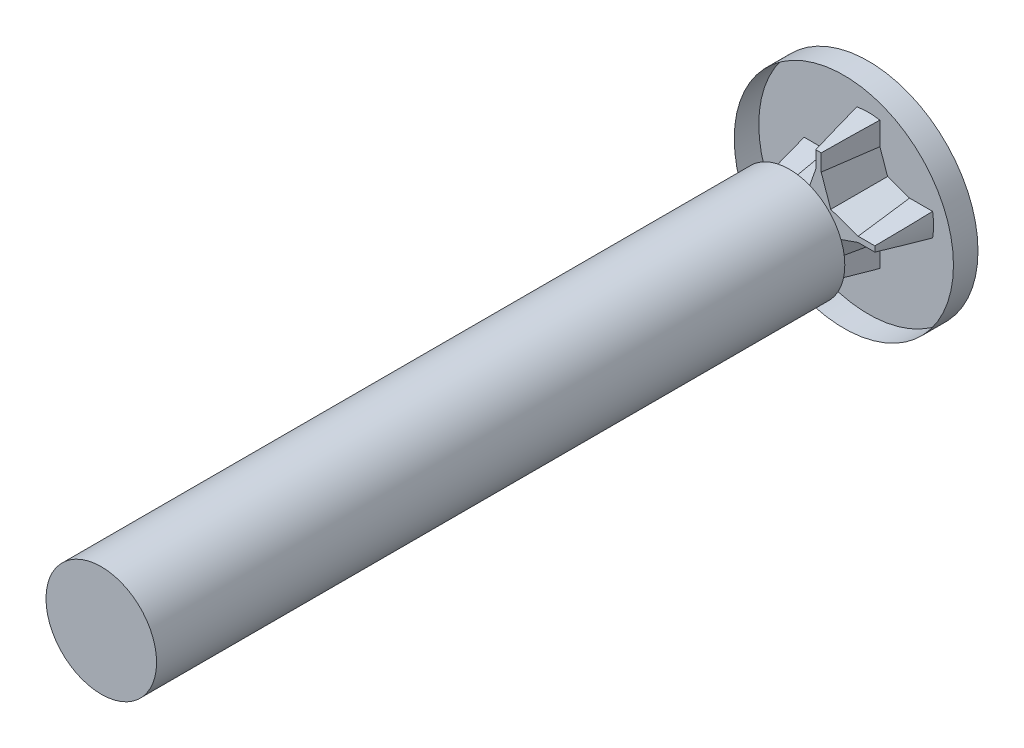
ISO-10303-21;
HEADER;
FILE_DESCRIPTION(('STEP AP214'),'2;1');
FILE_NAME('part.step','',(''),(''),'','','');
FILE_SCHEMA(('AUTOMOTIVE_DESIGN { 1 0 10303 214 1 1 1 1 }'));
ENDSEC;
DATA;
#1=APPLICATION_CONTEXT('core data for automotive mechanical design processes');
#2=APPLICATION_PROTOCOL_DEFINITION('international standard','automotive_design',2000,#1);
#3=PRODUCT_CONTEXT('',#1,'mechanical');
#4=PRODUCT('Part','Part','',(#3));
#5=PRODUCT_RELATED_PRODUCT_CATEGORY('part','',(#4));
#6=PRODUCT_DEFINITION_FORMATION('','',#4);
#7=PRODUCT_DEFINITION_CONTEXT('part definition',#1,'design');
#8=PRODUCT_DEFINITION('design','',#6,#7);
#9=PRODUCT_DEFINITION_SHAPE('','',#8);
#10=(LENGTH_UNIT() NAMED_UNIT(*) SI_UNIT(.MILLI.,.METRE.));
#11=(NAMED_UNIT(*) PLANE_ANGLE_UNIT() SI_UNIT($,.RADIAN.));
#12=(NAMED_UNIT(*) SI_UNIT($,.STERADIAN.) SOLID_ANGLE_UNIT());
#13=UNCERTAINTY_MEASURE_WITH_UNIT(LENGTH_MEASURE(1.E-05),#10,'distance_accuracy_value','');
#14=(GEOMETRIC_REPRESENTATION_CONTEXT(3) GLOBAL_UNCERTAINTY_ASSIGNED_CONTEXT((#13)) GLOBAL_UNIT_ASSIGNED_CONTEXT((#10,
#11,#12)) REPRESENTATION_CONTEXT('',''));
#15=CARTESIAN_POINT('',(0.,0.,0.));
#16=DIRECTION('',(0.,0.,1.));
#17=DIRECTION('',(1.,0.,0.));
#18=AXIS2_PLACEMENT_3D('',#15,#16,#17);
#19=CARTESIAN_POINT('',(-84.4266799469319,-54.699999999999,-15.25));
#20=DIRECTION('',(0.324374951621023,0.929853322386823,0.173648177666931));
#21=DIRECTION('',(0.,0.18357429952419,-0.983005837497521));
#22=AXIS2_PLACEMENT_3D('',#19,#20,#21);
#23=PLANE('',#22);
#24=DIRECTION('',(-0.944197808701955,0.329378958105137,0.));
#25=VECTOR('',#24,1.);
#26=CARTESIAN_POINT('',(-86.1310974403809,-54.1054219857371,-15.25));
#27=LINE('',#26,#25);
#28=CARTESIAN_POINT('',(-84.4266799469319,-54.699999999999,-15.25));
#29=VERTEX_POINT('',#28);
#30=CARTESIAN_POINT('',(-85.,-54.499999999999,-15.25));
#31=VERTEX_POINT('',#30);
#32=EDGE_CURVE('E39',#29,#31,#27,.T.);
#33=ORIENTED_EDGE('',*,*,#32,.F.);
#34=DIRECTION('',(-0.0294061236684748,-0.173573082893852,0.984381869390898));
#35=VECTOR('',#34,1.);
#36=CARTESIAN_POINT('',(-84.4264205308991,-54.6984687665366,-15.2586840564965));
#37=LINE('',#36,#35);
#38=CARTESIAN_POINT('',(-84.4655144297253,-54.92922507492,-13.95));
#39=VERTEX_POINT('',#38);
#40=EDGE_CURVE('E11',#29,#39,#37,.T.);
#41=ORIENTED_EDGE('',*,*,#40,.T.);
#42=DIRECTION('',(-0.944197808701955,0.329378958105137,0.));
#43=VECTOR('',#42,1.);
#44=CARTESIAN_POINT('',(-85.0691596927764,-54.7186462682584,-13.95));
#45=LINE('',#44,#43);
#46=CARTESIAN_POINT('',(-85.1799852830982,-54.6799852830971,-13.95));
#47=VERTEX_POINT('',#46);
#48=EDGE_CURVE('E27',#39,#47,#45,.T.);
#49=ORIENTED_EDGE('',*,*,#48,.T.);
#50=DIRECTION('',(-0.135870287320786,-0.135870287320797,0.981365645438402));
#51=VECTOR('',#50,1.);
#52=CARTESIAN_POINT('',(-84.9965541187195,-54.4965541187184,-15.2748889552948));
#53=LINE('',#52,#51);
#54=EDGE_CURVE('E294',#31,#47,#53,.T.);
#55=ORIENTED_EDGE('',*,*,#54,.F.);
#56=EDGE_LOOP('',(#33,#41,#49,#55));
#57=FACE_BOUND('',#56,.T.);
#58=ADVANCED_FACE('F17',(#57),#23,.F.);
#59=CARTESIAN_POINT('',(-83.8266799469319,-54.6999999999989,-15.25));
#60=DIRECTION('',(0.,0.984807753012208,0.17364817766693));
#61=DIRECTION('',(0.,0.17364817766693,-0.984807753012208));
#62=AXIS2_PLACEMENT_3D('',#59,#60,#61);
#63=PLANE('',#62);
#64=DIRECTION('',(-1.,0.,0.));
#65=VECTOR('',#64,1.);
#66=CARTESIAN_POINT('',(-86.0908399734659,-54.699999999999,-15.25));
#67=LINE('',#66,#65);
#68=CARTESIAN_POINT('',(-83.8266799469319,-54.6999999999989,-15.25));
#69=VERTEX_POINT('',#68);
#70=EDGE_CURVE('E292',#69,#29,#67,.T.);
#71=ORIENTED_EDGE('',*,*,#70,.F.);
#72=CARTESIAN_POINT('',(-83.8266799468012,-54.6999999999881,-15.2500000000479));
#73=CARTESIAN_POINT('',(-83.9288044414766,-54.8220621177477,-14.5577513307343));
#74=CARTESIAN_POINT('',(-84.0309289361519,-54.9292250749176,-13.95));
#75=(BOUNDED_CURVE() B_SPLINE_CURVE(2,(#72,#73,#74),.UNSPECIFIED.,.F.,
.F.) B_SPLINE_CURVE_WITH_KNOTS((3,3),(-111.917898219589,-110.972377017426),
.UNSPECIFIED.) CURVE() GEOMETRIC_REPRESENTATION_ITEM() RATIONAL_B_SPLINE_CURVE((1.,1.,1.)) REPRESENTATION_ITEM(''));
#76=CARTESIAN_POINT('',(-84.030928936293,-54.92922507492,-13.95));
#77=VERTEX_POINT('',#76);
#78=EDGE_CURVE('E402',#69,#77,#75,.T.);
#79=ORIENTED_EDGE('',*,*,#78,.T.);
#80=DIRECTION('',(-1.,0.,0.));
#81=VECTOR('',#80,1.);
#82=CARTESIAN_POINT('',(-84.6633399734659,-54.92922507492,-13.95));
#83=LINE('',#82,#81);
#84=EDGE_CURVE('E411',#77,#39,#83,.T.);
#85=ORIENTED_EDGE('',*,*,#84,.T.);
#86=ORIENTED_EDGE('',*,*,#40,.F.);
#87=EDGE_LOOP('',(#71,#79,#85,#86));
#88=FACE_BOUND('',#87,.T.);
#89=ADVANCED_FACE('F19',(#88),#63,.F.);
#90=CARTESIAN_POINT('',(-85.5,-54.999999999999,-15.25));
#91=DIRECTION('',(0.,0.,-1.));
#92=DIRECTION('',(-0.984305913569494,-0.176470588235328,0.));
#93=AXIS2_PLACEMENT_3D('',#90,#91,#92);
#94=CONICAL_SURFACE('',#93,1.7,0.174532925199433);
#95=CARTESIAN_POINT('',(-85.5,-54.999999999999,-15.25));
#96=DIRECTION('',(0.,0.,1.));
#97=DIRECTION('',(-0.984305913569494,-0.176470588235328,0.));
#98=AXIS2_PLACEMENT_3D('',#95,#96,#97);
#99=CIRCLE('',#98,1.7);
#100=CARTESIAN_POINT('',(-83.8266799469318,-55.2999999999989,-15.25));
#101=VERTEX_POINT('',#100);
#102=EDGE_CURVE('E289',#101,#69,#99,.T.);
#103=ORIENTED_EDGE('',*,*,#102,.F.);
#104=CARTESIAN_POINT('',(-83.826679946943,-55.3000000000114,-15.2500000000577));
#105=CARTESIAN_POINT('',(-83.9288044416291,-55.1779378822494,-14.5577513307303));
#106=CARTESIAN_POINT('',(-84.0309289363152,-55.0707749250802,-13.9500000000001));
#107=(BOUNDED_CURVE() B_SPLINE_CURVE(2,(#104,#105,#106),.UNSPECIFIED.,.F.,
.F.) B_SPLINE_CURVE_WITH_KNOTS((3,3),(-111.917898218827,-110.972377016565),
.UNSPECIFIED.) CURVE() GEOMETRIC_REPRESENTATION_ITEM() RATIONAL_B_SPLINE_CURVE((1.,1.,1.)) REPRESENTATION_ITEM(''));
#108=CARTESIAN_POINT('',(-84.030928936293,-55.0707749250779,-13.95));
#109=VERTEX_POINT('',#108);
#110=EDGE_CURVE('E308',#101,#109,#107,.T.);
#111=ORIENTED_EDGE('',*,*,#110,.T.);
#112=CARTESIAN_POINT('',(-85.5,-54.999999999999,-13.95));
#113=DIRECTION('',(0.,0.,1.));
#114=DIRECTION('',(-0.984305913569494,-0.176470588235328,0.));
#115=AXIS2_PLACEMENT_3D('',#112,#113,#114);
#116=CIRCLE('',#115,1.470774925079);
#117=EDGE_CURVE('E304',#109,#77,#116,.T.);
#118=ORIENTED_EDGE('',*,*,#117,.T.);
#119=ORIENTED_EDGE('',*,*,#78,.F.);
#120=EDGE_LOOP('',(#103,#111,#118,#119));
#121=FACE_BOUND('',#120,.T.);
#122=ADVANCED_FACE('F545',(#121),#94,.F.);
#123=CARTESIAN_POINT('',(-84.4266799469318,-55.299999999999,-15.25));
#124=DIRECTION('',(0.,-0.984807753012208,0.17364817766693));
#125=DIRECTION('',(-1.,0.,0.));
#126=AXIS2_PLACEMENT_3D('',#123,#124,#125);
#127=PLANE('',#126);
#128=DIRECTION('',(1.,0.,0.));
#129=VECTOR('',#128,1.);
#130=CARTESIAN_POINT('',(-86.3908399734659,-55.299999999999,-15.25));
#131=LINE('',#130,#129);
#132=CARTESIAN_POINT('',(-84.4266799469318,-55.299999999999,-15.25));
#133=VERTEX_POINT('',#132);
#134=EDGE_CURVE('E288',#133,#101,#131,.T.);
#135=ORIENTED_EDGE('',*,*,#134,.F.);
#136=DIRECTION('',(-0.0294061236684868,0.17357308289385,0.984381869390898));
#137=VECTOR('',#136,1.);
#138=CARTESIAN_POINT('',(-84.4264174164672,-55.3015496167597,-15.2587883133625));
#139=LINE('',#138,#137);
#140=CARTESIAN_POINT('',(-84.4655144297253,-55.070774925078,-13.95));
#141=VERTEX_POINT('',#140);
#142=EDGE_CURVE('E309',#133,#141,#139,.T.);
#143=ORIENTED_EDGE('',*,*,#142,.T.);
#144=DIRECTION('',(1.,0.,0.));
#145=VECTOR('',#144,1.);
#146=CARTESIAN_POINT('',(-84.9633399734659,-55.070774925078,-13.95));
#147=LINE('',#146,#145);
#148=EDGE_CURVE('E327',#141,#109,#147,.T.);
#149=ORIENTED_EDGE('',*,*,#148,.T.);
#150=ORIENTED_EDGE('',*,*,#110,.F.);
#151=EDGE_LOOP('',(#135,#143,#149,#150));
#152=FACE_BOUND('',#151,.T.);
#153=ADVANCED_FACE('F540',(#152),#127,.F.);
#154=CARTESIAN_POINT('',(-85.,-55.499999999999,-15.25));
#155=DIRECTION('',(0.324374951621089,-0.9298533223868,0.173648177666931));
#156=DIRECTION('',(-0.471959275707467,0.,0.881620350306005));
#157=AXIS2_PLACEMENT_3D('',#154,#155,#156);
#158=PLANE('',#157);
#159=DIRECTION('',(0.944197808701932,0.329378958105205,0.));
#160=VECTOR('',#159,1.);
#161=CARTESIAN_POINT('',(-86.4177574669149,-55.994578014261,-15.25));
#162=LINE('',#161,#160);
#163=CARTESIAN_POINT('',(-85.,-55.499999999999,-15.25));
#164=VERTEX_POINT('',#163);
#165=EDGE_CURVE('E283',#164,#133,#162,.T.);
#166=ORIENTED_EDGE('',*,*,#165,.F.);
#167=DIRECTION('',(-0.135870287320796,0.135870287320786,0.981365645438402));
#168=VECTOR('',#167,1.);
#169=CARTESIAN_POINT('',(-84.9965541187194,-55.5034458812796,-15.2748889552948));
#170=LINE('',#169,#168);
#171=CARTESIAN_POINT('',(-85.1799852830981,-55.3200147169008,-13.95));
#172=VERTEX_POINT('',#171);
#173=EDGE_CURVE('E525',#164,#172,#170,.T.);
#174=ORIENTED_EDGE('',*,*,#173,.T.);
#175=DIRECTION('',(0.944197808701932,0.329378958105205,0.));
#176=VECTOR('',#175,1.);
#177=CARTESIAN_POINT('',(-85.0854394191287,-55.287032837595,-13.95));
#178=LINE('',#177,#176);
#179=EDGE_CURVE('E21',#172,#141,#178,.T.);
#180=ORIENTED_EDGE('',*,*,#179,.T.);
#181=ORIENTED_EDGE('',*,*,#142,.F.);
#182=EDGE_LOOP('',(#166,#174,#180,#181));
#183=FACE_BOUND('',#182,.T.);
#184=ADVANCED_FACE('F549',(#183),#158,.F.);
#185=CARTESIAN_POINT('',(-85.2,-56.0733200530671,-15.25));
#186=DIRECTION('',(0.929853322386823,-0.324374951621022,0.17364817766693));
#187=DIRECTION('',(0.,0.471959275707471,0.881620350306003));
#188=AXIS2_PLACEMENT_3D('',#185,#186,#187);
#189=PLANE('',#188);
#190=DIRECTION('',(0.329378958105137,0.944197808701955,0.));
#191=VECTOR('',#190,1.);
#192=CARTESIAN_POINT('',(-85.2042430878473,-56.0854832898162,-15.25));
#193=LINE('',#192,#191);
#194=CARTESIAN_POINT('',(-85.2,-56.0733200530671,-15.25));
#195=VERTEX_POINT('',#194);
#196=EDGE_CURVE('E287',#195,#164,#193,.T.);
#197=ORIENTED_EDGE('',*,*,#196,.F.);
#198=DIRECTION('',(-0.173573082893852,0.0294061236684751,0.984381869390898));
#199=VECTOR('',#198,1.);
#200=CARTESIAN_POINT('',(-85.1984687665376,-56.0735794690999,-15.2586840564965));
#201=LINE('',#200,#199);
#202=CARTESIAN_POINT('',(-85.429225074921,-56.0344855702737,-13.95));
#203=VERTEX_POINT('',#202);
#204=EDGE_CURVE('E388',#195,#203,#201,.T.);
#205=ORIENTED_EDGE('',*,*,#204,.T.);
#206=DIRECTION('',(0.329378958105137,0.944197808701955,0.));
#207=VECTOR('',#206,1.);
#208=CARTESIAN_POINT('',(-85.1306165652408,-55.1784943371915,-13.95));
#209=LINE('',#208,#207);
#210=EDGE_CURVE('E384',#203,#172,#209,.T.);
#211=ORIENTED_EDGE('',*,*,#210,.T.);
#212=ORIENTED_EDGE('',*,*,#173,.F.);
#213=EDGE_LOOP('',(#197,#205,#211,#212));
#214=FACE_BOUND('',#213,.T.);
#215=ADVANCED_FACE('F821',(#214),#189,.F.);
#216=CARTESIAN_POINT('',(-85.2,-56.6733200530671,-15.25));
#217=DIRECTION('',(0.984807753012208,0.,0.17364817766693));
#218=DIRECTION('',(0.,1.,0.));
#219=AXIS2_PLACEMENT_3D('',#216,#217,#218);
#220=PLANE('',#219);
#221=DIRECTION('',(0.,1.,0.));
#222=VECTOR('',#221,1.);
#223=CARTESIAN_POINT('',(-85.2,-55.8366600265331,-15.25));
#224=LINE('',#223,#222);
#225=CARTESIAN_POINT('',(-85.2,-56.6733200530671,-15.25));
#226=VERTEX_POINT('',#225);
#227=EDGE_CURVE('E357',#226,#195,#224,.T.);
#228=ORIENTED_EDGE('',*,*,#227,.F.);
#229=CARTESIAN_POINT('',(-85.1999999999918,-56.6733200530572,-15.2500000000642));
#230=CARTESIAN_POINT('',(-85.3220621177545,-56.5711955583702,-14.5577513307331));
#231=CARTESIAN_POINT('',(-85.4292250749242,-56.4690710636832,-13.9500000000001));
#232=(BOUNDED_CURVE() B_SPLINE_CURVE(2,(#229,#230,#231),.UNSPECIFIED.,.F.,
.F.) B_SPLINE_CURVE_WITH_KNOTS((3,3),(-111.917898218817,-110.972377016549),
.UNSPECIFIED.) CURVE() GEOMETRIC_REPRESENTATION_ITEM() RATIONAL_B_SPLINE_CURVE((1.,1.,1.)) REPRESENTATION_ITEM(''));
#233=CARTESIAN_POINT('',(-85.429225074921,-56.469071063706,-13.95));
#234=VERTEX_POINT('',#233);
#235=EDGE_CURVE('E389',#226,#234,#232,.T.);
#236=ORIENTED_EDGE('',*,*,#235,.T.);
#237=DIRECTION('',(0.,1.,0.));
#238=VECTOR('',#237,1.);
#239=CARTESIAN_POINT('',(-85.429225074921,-55.4019634593388,-13.95));
#240=LINE('',#239,#238);
#241=EDGE_CURVE('E491',#234,#203,#240,.T.);
#242=ORIENTED_EDGE('',*,*,#241,.T.);
#243=ORIENTED_EDGE('',*,*,#204,.F.);
#244=EDGE_LOOP('',(#228,#236,#242,#243));
#245=FACE_BOUND('',#244,.T.);
#246=ADVANCED_FACE('F818',(#245),#220,.F.);
#247=CARTESIAN_POINT('',(-85.5,-54.999999999999,-15.25));
#248=DIRECTION('',(0.,0.,-1.));
#249=DIRECTION('',(-0.176470588235328,0.984305913569494,0.));
#250=AXIS2_PLACEMENT_3D('',#247,#248,#249);
#251=CONICAL_SURFACE('',#250,1.7,0.174532925199433);
#252=CARTESIAN_POINT('',(-85.5,-54.999999999999,-15.25));
#253=DIRECTION('',(0.,0.,1.));
#254=DIRECTION('',(-0.176470588235328,0.984305913569494,0.));
#255=AXIS2_PLACEMENT_3D('',#252,#253,#254);
#256=CIRCLE('',#255,1.7);
#257=CARTESIAN_POINT('',(-85.7999999999999,-56.6733200530672,-15.25));
#258=VERTEX_POINT('',#257);
#259=EDGE_CURVE('E445',#258,#226,#256,.T.);
#260=ORIENTED_EDGE('',*,*,#259,.F.);
#261=CARTESIAN_POINT('',(-85.8000000000098,-56.6733200531708,-15.2500000000433));
#262=CARTESIAN_POINT('',(-85.6779378822505,-56.571195558494,-14.5577513307308));
#263=CARTESIAN_POINT('',(-85.5707749250812,-56.4690710638172,-13.9500000000001));
#264=(BOUNDED_CURVE() B_SPLINE_CURVE(2,(#261,#262,#263),.UNSPECIFIED.,.F.,
.F.) B_SPLINE_CURVE_WITH_KNOTS((3,3),(-111.917898219449,-110.972377017273),
.UNSPECIFIED.) CURVE() GEOMETRIC_REPRESENTATION_ITEM() RATIONAL_B_SPLINE_CURVE((1.,1.,1.)) REPRESENTATION_ITEM(''));
#265=CARTESIAN_POINT('',(-85.570774925079,-56.469071063706,-13.95));
#266=VERTEX_POINT('',#265);
#267=EDGE_CURVE('E393',#258,#266,#264,.T.);
#268=ORIENTED_EDGE('',*,*,#267,.T.);
#269=CARTESIAN_POINT('',(-85.5,-54.999999999999,-13.95));
#270=DIRECTION('',(0.,0.,1.));
#271=DIRECTION('',(-0.176470588235328,0.984305913569494,0.));
#272=AXIS2_PLACEMENT_3D('',#269,#270,#271);
#273=CIRCLE('',#272,1.470774925079);
#274=EDGE_CURVE('E378',#266,#234,#273,.T.);
#275=ORIENTED_EDGE('',*,*,#274,.T.);
#276=ORIENTED_EDGE('',*,*,#235,.F.);
#277=EDGE_LOOP('',(#260,#268,#275,#276));
#278=FACE_BOUND('',#277,.T.);
#279=ADVANCED_FACE('F816',(#278),#251,.F.);
#280=CARTESIAN_POINT('',(-85.8,-56.0733200530672,-15.25));
#281=DIRECTION('',(-0.984807753012208,0.,0.173648177666931));
#282=DIRECTION('',(0.173648177666931,0.,0.984807753012208));
#283=AXIS2_PLACEMENT_3D('',#280,#281,#282);
#284=PLANE('',#283);
#285=DIRECTION('',(0.,-1.,0.));
#286=VECTOR('',#285,1.);
#287=CARTESIAN_POINT('',(-85.8,-55.5366600265331,-15.25));
#288=LINE('',#287,#286);
#289=CARTESIAN_POINT('',(-85.8,-56.0733200530672,-15.25));
#290=VERTEX_POINT('',#289);
#291=EDGE_CURVE('E472',#290,#258,#288,.T.);
#292=ORIENTED_EDGE('',*,*,#291,.F.);
#293=DIRECTION('',(0.173573082893851,0.0294061236684872,0.984381869390898));
#294=VECTOR('',#293,1.);
#295=CARTESIAN_POINT('',(-85.8015496167607,-56.0735825835318,-15.2587883133625));
#296=LINE('',#295,#294);
#297=CARTESIAN_POINT('',(-85.570774925079,-56.0344855702737,-13.95));
#298=VERTEX_POINT('',#297);
#299=EDGE_CURVE('E370',#290,#298,#296,.T.);
#300=ORIENTED_EDGE('',*,*,#299,.T.);
#301=DIRECTION('',(0.,-1.,0.));
#302=VECTOR('',#301,1.);
#303=CARTESIAN_POINT('',(-85.570774925079,-55.1019634593388,-13.95));
#304=LINE('',#303,#302);
#305=EDGE_CURVE('E351',#298,#266,#304,.T.);
#306=ORIENTED_EDGE('',*,*,#305,.T.);
#307=ORIENTED_EDGE('',*,*,#267,.F.);
#308=EDGE_LOOP('',(#292,#300,#306,#307));
#309=FACE_BOUND('',#308,.T.);
#310=ADVANCED_FACE('F812',(#309),#284,.F.);
#311=CARTESIAN_POINT('',(-86.,-55.499999999999,-15.25));
#312=DIRECTION('',(-0.9298533223868,-0.324374951621089,0.173648177666931));
#313=DIRECTION('',(0.18357429952419,0.,0.983005837497521));
#314=AXIS2_PLACEMENT_3D('',#311,#312,#313);
#315=PLANE('',#314);
#316=DIRECTION('',(0.329378958105205,-0.944197808701932,0.));
#317=VECTOR('',#316,1.);
#318=CARTESIAN_POINT('',(-86.2054972840639,-54.9109214309748,-15.25));
#319=LINE('',#318,#317);
#320=CARTESIAN_POINT('',(-86.,-55.499999999999,-15.25));
#321=VERTEX_POINT('',#320);
#322=EDGE_CURVE('E438',#321,#290,#319,.T.);
#323=ORIENTED_EDGE('',*,*,#322,.F.);
#324=DIRECTION('',(0.135870287320787,0.135870287320797,0.981365645438402));
#325=VECTOR('',#324,1.);
#326=CARTESIAN_POINT('',(-86.0034458812806,-55.5034458812796,-15.2748889552948));
#327=LINE('',#326,#325);
#328=CARTESIAN_POINT('',(-85.8200147169018,-55.3200147169009,-13.95));
#329=VERTEX_POINT('',#328);
#330=EDGE_CURVE('E348',#321,#329,#327,.T.);
#331=ORIENTED_EDGE('',*,*,#330,.T.);
#332=DIRECTION('',(0.329378958105205,-0.944197808701932,0.));
#333=VECTOR('',#332,1.);
#334=CARTESIAN_POINT('',(-85.9693834347592,-54.8918343106574,-13.95));
#335=LINE('',#334,#333);
#336=EDGE_CURVE('E352',#329,#298,#335,.T.);
#337=ORIENTED_EDGE('',*,*,#336,.T.);
#338=ORIENTED_EDGE('',*,*,#299,.F.);
#339=EDGE_LOOP('',(#323,#331,#337,#338));
#340=FACE_BOUND('',#339,.T.);
#341=ADVANCED_FACE('F809',(#340),#315,.F.);
#342=CARTESIAN_POINT('',(-86.5733200530681,-55.299999999999,-15.25));
#343=DIRECTION('',(-0.324374951621022,-0.929853322386823,0.17364817766693));
#344=DIRECTION('',(0.47195927570747,0.,0.881620350306004));
#345=AXIS2_PLACEMENT_3D('',#342,#343,#344);
#346=PLANE('',#345);
#347=DIRECTION('',(0.944197808701955,-0.329378958105137,0.));
#348=VECTOR('',#347,1.);
#349=CARTESIAN_POINT('',(-87.414162187708,-55.0066761819536,-15.25));
#350=LINE('',#349,#348);
#351=CARTESIAN_POINT('',(-86.5733200530681,-55.299999999999,-15.25));
#352=VERTEX_POINT('',#351);
#353=EDGE_CURVE('E381',#352,#321,#350,.T.);
#354=ORIENTED_EDGE('',*,*,#353,.F.);
#355=DIRECTION('',(0.0294061236684754,0.173573082893852,0.984381869390898));
#356=VECTOR('',#355,1.);
#357=CARTESIAN_POINT('',(-86.5735794691009,-55.3015312334614,-15.2586840564965));
#358=LINE('',#357,#356);
#359=CARTESIAN_POINT('',(-86.5344855702747,-55.070774925078,-13.95));
#360=VERTEX_POINT('',#359);
#361=EDGE_CURVE('E281',#352,#360,#358,.T.);
#362=ORIENTED_EDGE('',*,*,#361,.T.);
#363=DIRECTION('',(0.944197808701955,-0.329378958105137,0.));
#364=VECTOR('',#363,1.);
#365=CARTESIAN_POINT('',(-86.2012206074054,-55.1870328375951,-13.95));
#366=LINE('',#365,#364);
#367=EDGE_CURVE('E299',#360,#329,#366,.T.);
#368=ORIENTED_EDGE('',*,*,#367,.T.);
#369=ORIENTED_EDGE('',*,*,#330,.F.);
#370=EDGE_LOOP('',(#354,#362,#368,#369));
#371=FACE_BOUND('',#370,.T.);
#372=ADVANCED_FACE('F807',(#371),#346,.F.);
#373=CARTESIAN_POINT('',(-87.1733200530681,-55.2999999999991,-15.25));
#374=DIRECTION('',(0.,-0.984807753012208,0.17364817766693));
#375=DIRECTION('',(-1.,0.,0.));
#376=AXIS2_PLACEMENT_3D('',#373,#374,#375);
#377=PLANE('',#376);
#378=DIRECTION('',(1.,0.,0.));
#379=VECTOR('',#378,1.);
#380=CARTESIAN_POINT('',(-87.7641600265341,-55.2999999999991,-15.25));
#381=LINE('',#380,#379);
#382=CARTESIAN_POINT('',(-87.1733200530681,-55.2999999999991,-15.25));
#383=VERTEX_POINT('',#382);
#384=EDGE_CURVE('E236',#383,#352,#381,.T.);
#385=ORIENTED_EDGE('',*,*,#384,.F.);
#386=CARTESIAN_POINT('',(-87.1733200531264,-55.3000000000106,-15.250000000052));
#387=CARTESIAN_POINT('',(-87.0711955584458,-55.1779378822499,-14.557751330732));
#388=CARTESIAN_POINT('',(-86.9690710637651,-55.0707749250804,-13.9500000000001));
#389=(BOUNDED_CURVE() B_SPLINE_CURVE(2,(#386,#387,#388),.UNSPECIFIED.,.F.,
.F.) B_SPLINE_CURVE_WITH_KNOTS((3,3),(-111.917898219208,-110.972377016996),
.UNSPECIFIED.) CURVE() GEOMETRIC_REPRESENTATION_ITEM() RATIONAL_B_SPLINE_CURVE((1.,1.,1.)) REPRESENTATION_ITEM(''));
#390=CARTESIAN_POINT('',(-86.969071063707,-55.070774925078,-13.95));
#391=VERTEX_POINT('',#390);
#392=EDGE_CURVE('E303',#383,#391,#389,.T.);
#393=ORIENTED_EDGE('',*,*,#392,.T.);
#394=DIRECTION('',(1.,0.,0.));
#395=VECTOR('',#394,1.);
#396=CARTESIAN_POINT('',(-86.3366600265341,-55.070774925078,-13.95));
#397=LINE('',#396,#395);
#398=EDGE_CURVE('E225',#391,#360,#397,.T.);
#399=ORIENTED_EDGE('',*,*,#398,.T.);
#400=ORIENTED_EDGE('',*,*,#361,.F.);
#401=EDGE_LOOP('',(#385,#393,#399,#400));
#402=FACE_BOUND('',#401,.T.);
#403=ADVANCED_FACE('F804',(#402),#377,.F.);
#404=CARTESIAN_POINT('',(-85.5,-54.999999999999,-15.25));
#405=DIRECTION('',(0.,0.,-1.));
#406=DIRECTION('',(0.984305913569494,0.176470588235328,0.));
#407=AXIS2_PLACEMENT_3D('',#404,#405,#406);
#408=CONICAL_SURFACE('',#407,1.7,0.174532925199433);
#409=CARTESIAN_POINT('',(-85.5,-54.999999999999,-15.25));
#410=DIRECTION('',(0.,0.,1.));
#411=DIRECTION('',(0.984305913569494,0.176470588235328,0.));
#412=AXIS2_PLACEMENT_3D('',#409,#410,#411);
#413=CIRCLE('',#412,1.7);
#414=CARTESIAN_POINT('',(-87.1733200530682,-54.6999999999991,-15.25));
#415=VERTEX_POINT('',#414);
#416=EDGE_CURVE('E347',#415,#383,#413,.T.);
#417=ORIENTED_EDGE('',*,*,#416,.F.);
#418=CARTESIAN_POINT('',(-87.1733200530565,-54.6999999999857,-15.2500000000629));
#419=CARTESIAN_POINT('',(-87.07119555837,-54.8220621177481,-14.5577513307327));
#420=CARTESIAN_POINT('',(-86.9690710636835,-54.9292250749178,-13.9500000000001));
#421=(BOUNDED_CURVE() B_SPLINE_CURVE(2,(#418,#419,#420),.UNSPECIFIED.,.F.,
.F.) B_SPLINE_CURVE_WITH_KNOTS((3,3),(-111.91789821883,-110.972377016565),
.UNSPECIFIED.) CURVE() GEOMETRIC_REPRESENTATION_ITEM() RATIONAL_B_SPLINE_CURVE((1.,1.,1.)) REPRESENTATION_ITEM(''));
#422=CARTESIAN_POINT('',(-86.969071063707,-54.9292250749201,-13.95));
#423=VERTEX_POINT('',#422);
#424=EDGE_CURVE('E338',#415,#423,#421,.T.);
#425=ORIENTED_EDGE('',*,*,#424,.T.);
#426=CARTESIAN_POINT('',(-85.5,-54.999999999999,-13.95));
#427=DIRECTION('',(0.,0.,1.));
#428=DIRECTION('',(0.984305913569494,0.176470588235328,0.));
#429=AXIS2_PLACEMENT_3D('',#426,#427,#428);
#430=CIRCLE('',#429,1.470774925079);
#431=EDGE_CURVE('E334',#423,#391,#430,.T.);
#432=ORIENTED_EDGE('',*,*,#431,.T.);
#433=ORIENTED_EDGE('',*,*,#392,.F.);
#434=EDGE_LOOP('',(#417,#425,#432,#433));
#435=FACE_BOUND('',#434,.T.);
#436=ADVANCED_FACE('F803',(#435),#408,.F.);
#437=CARTESIAN_POINT('',(-86.5733200530682,-54.699999999999,-15.25));
#438=DIRECTION('',(0.,0.984807753012208,0.17364817766693));
#439=DIRECTION('',(0.,0.17364817766693,-0.984807753012208));
#440=AXIS2_PLACEMENT_3D('',#437,#438,#439);
#441=PLANE('',#440);
#442=DIRECTION('',(-1.,0.,0.));
#443=VECTOR('',#442,1.);
#444=CARTESIAN_POINT('',(-87.4641600265341,-54.6999999999991,-15.25));
#445=LINE('',#444,#443);
#446=CARTESIAN_POINT('',(-86.5733200530682,-54.699999999999,-15.25));
#447=VERTEX_POINT('',#446);
#448=EDGE_CURVE('E343',#447,#415,#445,.T.);
#449=ORIENTED_EDGE('',*,*,#448,.F.);
#450=DIRECTION('',(0.0294061236684876,-0.17357308289385,0.984381869390898));
#451=VECTOR('',#450,1.);
#452=CARTESIAN_POINT('',(-86.5735825835328,-54.6984503832383,-15.2587883133625));
#453=LINE('',#452,#451);
#454=CARTESIAN_POINT('',(-86.5344855702747,-54.92922507492,-13.95));
#455=VERTEX_POINT('',#454);
#456=EDGE_CURVE('E339',#447,#455,#453,.T.);
#457=ORIENTED_EDGE('',*,*,#456,.T.);
#458=DIRECTION('',(-1.,0.,0.));
#459=VECTOR('',#458,1.);
#460=CARTESIAN_POINT('',(-86.0366600265341,-54.92922507492,-13.95));
#461=LINE('',#460,#459);
#462=EDGE_CURVE('E248',#455,#423,#461,.T.);
#463=ORIENTED_EDGE('',*,*,#462,.T.);
#464=ORIENTED_EDGE('',*,*,#424,.F.);
#465=EDGE_LOOP('',(#449,#457,#463,#464));
#466=FACE_BOUND('',#465,.T.);
#467=ADVANCED_FACE('F801',(#466),#441,.F.);
#468=CARTESIAN_POINT('',(-86.,-54.499999999999,-15.25));
#469=DIRECTION('',(-0.324374951621089,0.9298533223868,0.17364817766693));
#470=DIRECTION('',(0.944197808701932,0.329378958105206,0.));
#471=AXIS2_PLACEMENT_3D('',#468,#469,#470);
#472=PLANE('',#471);
#473=DIRECTION('',(-0.944197808701932,-0.329378958105205,0.));
#474=VECTOR('',#473,1.);
#475=CARTESIAN_POINT('',(-87.1275021611739,-54.8933238180445,-15.25));
#476=LINE('',#475,#474);
#477=CARTESIAN_POINT('',(-86.,-54.499999999999,-15.25));
#478=VERTEX_POINT('',#477);
#479=EDGE_CURVE('E259',#478,#447,#476,.T.);
#480=ORIENTED_EDGE('',*,*,#479,.F.);
#481=DIRECTION('',(0.135870287320797,-0.135870287320786,0.981365645438402));
#482=VECTOR('',#481,1.);
#483=CARTESIAN_POINT('',(-86.0034458812806,-54.4965541187184,-15.2748889552948));
#484=LINE('',#483,#482);
#485=CARTESIAN_POINT('',(-85.8200147169019,-54.6799852830972,-13.95));
#486=VERTEX_POINT('',#485);
#487=EDGE_CURVE('E253',#478,#486,#484,.T.);
#488=ORIENTED_EDGE('',*,*,#487,.T.);
#489=DIRECTION('',(-0.944197808701932,-0.329378958105205,0.));
#490=VECTOR('',#489,1.);
#491=CARTESIAN_POINT('',(-85.6441802806895,-54.6186462682585,-13.95));
#492=LINE('',#491,#490);
#493=EDGE_CURVE('E241',#486,#455,#492,.T.);
#494=ORIENTED_EDGE('',*,*,#493,.T.);
#495=ORIENTED_EDGE('',*,*,#456,.F.);
#496=EDGE_LOOP('',(#480,#488,#494,#495));
#497=FACE_BOUND('',#496,.T.);
#498=ADVANCED_FACE('F257',(#497),#472,.F.);
#499=CARTESIAN_POINT('',(-85.8,-53.9266799469309,-15.25));
#500=DIRECTION('',(-0.929853322386823,0.324374951621022,0.173648177666931));
#501=DIRECTION('',(0.329378958105137,0.944197808701955,0.));
#502=AXIS2_PLACEMENT_3D('',#499,#500,#501);
#503=PLANE('',#502);
#504=DIRECTION('',(-0.329378958105137,-0.944197808701955,0.));
#505=VECTOR('',#504,1.);
#506=CARTESIAN_POINT('',(-86.1054972840639,-54.8024185424892,-15.25));
#507=LINE('',#506,#505);
#508=CARTESIAN_POINT('',(-85.8,-53.9266799469309,-15.25));
#509=VERTEX_POINT('',#508);
#510=EDGE_CURVE('E473',#509,#478,#507,.T.);
#511=ORIENTED_EDGE('',*,*,#510,.F.);
#512=DIRECTION('',(0.173573082893853,-0.0294061236684752,0.984381869390898));
#513=VECTOR('',#512,1.);
#514=CARTESIAN_POINT('',(-85.8015312334624,-53.9264205308981,-15.2586840564965));
#515=LINE('',#514,#513);
#516=CARTESIAN_POINT('',(-85.570774925079,-53.9655144297243,-13.95));
#517=VERTEX_POINT('',#516);
#518=EDGE_CURVE('E254',#509,#517,#515,.T.);
#519=ORIENTED_EDGE('',*,*,#518,.T.);
#520=DIRECTION('',(-0.329378958105137,-0.944197808701955,0.));
#521=VECTOR('',#520,1.);
#522=CARTESIAN_POINT('',(-85.5990031345774,-54.0464334225625,-13.95));
#523=LINE('',#522,#521);
#524=EDGE_CURVE('E245',#517,#486,#523,.T.);
#525=ORIENTED_EDGE('',*,*,#524,.T.);
#526=ORIENTED_EDGE('',*,*,#487,.F.);
#527=EDGE_LOOP('',(#511,#519,#525,#526));
#528=FACE_BOUND('',#527,.T.);
#529=ADVANCED_FACE('F264',(#528),#503,.F.);
#530=CARTESIAN_POINT('',(-85.8000000000001,-53.3266799469309,-15.25));
#531=DIRECTION('',(-0.984807753012208,0.,0.173648177666931));
#532=DIRECTION('',(0.173648177666931,0.,0.984807753012208));
#533=AXIS2_PLACEMENT_3D('',#530,#531,#532);
#534=PLANE('',#533);
#535=DIRECTION('',(0.,-1.,0.));
#536=VECTOR('',#535,1.);
#537=CARTESIAN_POINT('',(-85.8,-54.1633399734649,-15.25));
#538=LINE('',#537,#536);
#539=CARTESIAN_POINT('',(-85.8000000000001,-53.3266799469309,-15.25));
#540=VERTEX_POINT('',#539);
#541=EDGE_CURVE('E468',#540,#509,#538,.T.);
#542=ORIENTED_EDGE('',*,*,#541,.F.);
#543=CARTESIAN_POINT('',(-85.8000000000136,-53.3266799469674,-15.2500000000635));
#544=CARTESIAN_POINT('',(-85.6779378822508,-53.4288044416557,-14.5577513307314));
#545=CARTESIAN_POINT('',(-85.5707749250814,-53.530928936344,-13.95));
#546=(BOUNDED_CURVE() B_SPLINE_CURVE(2,(#543,#544,#545),.UNSPECIFIED.,.F.,
.F.) B_SPLINE_CURVE_WITH_KNOTS((3,3),(96.4254388124184,97.3709600147006),
.UNSPECIFIED.) CURVE() GEOMETRIC_REPRESENTATION_ITEM() RATIONAL_B_SPLINE_CURVE((1.,1.,1.)) REPRESENTATION_ITEM(''));
#547=CARTESIAN_POINT('',(-85.5707749250791,-53.530928936292,-13.95));
#548=VERTEX_POINT('',#547);
#549=EDGE_CURVE('E268',#540,#548,#546,.T.);
#550=ORIENTED_EDGE('',*,*,#549,.T.);
#551=DIRECTION('',(0.,-1.,0.));
#552=VECTOR('',#551,1.);
#553=CARTESIAN_POINT('',(-85.570774925079,-53.7286434062707,-13.95));
#554=LINE('',#553,#552);
#555=EDGE_CURVE('E277',#548,#517,#554,.T.);
#556=ORIENTED_EDGE('',*,*,#555,.T.);
#557=ORIENTED_EDGE('',*,*,#518,.F.);
#558=EDGE_LOOP('',(#542,#550,#556,#557));
#559=FACE_BOUND('',#558,.T.);
#560=ADVANCED_FACE('F798',(#559),#534,.F.);
#561=CARTESIAN_POINT('',(-85.5,-54.999999999999,-15.25));
#562=DIRECTION('',(0.,0.,-1.));
#563=DIRECTION('',(0.176470588235328,-0.984305913569494,0.));
#564=AXIS2_PLACEMENT_3D('',#561,#562,#563);
#565=CONICAL_SURFACE('',#564,1.7,0.174532925199433);
#566=CARTESIAN_POINT('',(-85.5,-54.999999999999,-15.25));
#567=DIRECTION('',(0.,0.,1.));
#568=DIRECTION('',(0.176470588235328,-0.984305913569494,0.));
#569=AXIS2_PLACEMENT_3D('',#566,#567,#568);
#570=CIRCLE('',#569,1.7);
#571=CARTESIAN_POINT('',(-85.2000000000001,-53.3266799469308,-15.25));
#572=VERTEX_POINT('',#571);
#573=EDGE_CURVE('E374',#572,#540,#570,.T.);
#574=ORIENTED_EDGE('',*,*,#573,.F.);
#575=CARTESIAN_POINT('',(-85.1999999999927,-53.326679946943,-15.2500000000615));
#576=CARTESIAN_POINT('',(-85.3220621177551,-53.4288044416299,-14.5577513307317));
#577=CARTESIAN_POINT('',(-85.4292250749246,-53.5309289363168,-13.95));
#578=(BOUNDED_CURVE() B_SPLINE_CURVE(2,(#575,#576,#577),.UNSPECIFIED.,.F.,
.F.) B_SPLINE_CURVE_WITH_KNOTS((3,3),(-111.917898218806,-110.972377016539),
.UNSPECIFIED.) CURVE() GEOMETRIC_REPRESENTATION_ITEM() RATIONAL_B_SPLINE_CURVE((1.,1.,1.)) REPRESENTATION_ITEM(''));
#579=CARTESIAN_POINT('',(-85.4292250749211,-53.530928936292,-13.95));
#580=VERTEX_POINT('',#579);
#581=EDGE_CURVE('E312',#572,#580,#578,.T.);
#582=ORIENTED_EDGE('',*,*,#581,.T.);
#583=CARTESIAN_POINT('',(-85.5,-54.999999999999,-13.95));
#584=DIRECTION('',(0.,0.,1.));
#585=DIRECTION('',(0.176470588235328,-0.984305913569494,0.));
#586=AXIS2_PLACEMENT_3D('',#583,#584,#585);
#587=CIRCLE('',#586,1.470774925079);
#588=EDGE_CURVE('E424',#580,#548,#587,.T.);
#589=ORIENTED_EDGE('',*,*,#588,.T.);
#590=ORIENTED_EDGE('',*,*,#549,.F.);
#591=EDGE_LOOP('',(#574,#582,#589,#590));
#592=FACE_BOUND('',#591,.T.);
#593=ADVANCED_FACE('F796',(#592),#565,.F.);
#594=CARTESIAN_POINT('',(-85.2,-53.9266799469308,-15.25));
#595=DIRECTION('',(0.984807753012208,0.,0.17364817766693));
#596=DIRECTION('',(0.,1.,0.));
#597=AXIS2_PLACEMENT_3D('',#594,#595,#596);
#598=PLANE('',#597);
#599=DIRECTION('',(0.,1.,0.));
#600=VECTOR('',#599,1.);
#601=CARTESIAN_POINT('',(-85.2,-54.4633399734649,-15.25));
#602=LINE('',#601,#600);
#603=CARTESIAN_POINT('',(-85.2,-53.9266799469308,-15.25));
#604=VERTEX_POINT('',#603);
#605=EDGE_CURVE('E323',#604,#572,#602,.T.);
#606=ORIENTED_EDGE('',*,*,#605,.F.);
#607=DIRECTION('',(-0.17357308289385,-0.0294061236684873,0.984381869390898));
#608=VECTOR('',#607,1.);
#609=CARTESIAN_POINT('',(-85.1984503832393,-53.9264174164662,-15.2587883133625));
#610=LINE('',#609,#608);
#611=CARTESIAN_POINT('',(-85.429225074921,-53.9655144297243,-13.95));
#612=VERTEX_POINT('',#611);
#613=EDGE_CURVE('E420',#604,#612,#610,.T.);
#614=ORIENTED_EDGE('',*,*,#613,.T.);
#615=DIRECTION('',(0.,1.,0.));
#616=VECTOR('',#615,1.);
#617=CARTESIAN_POINT('',(-85.429225074921,-54.0286434062707,-13.95));
#618=LINE('',#617,#616);
#619=EDGE_CURVE('E297',#612,#580,#618,.T.);
#620=ORIENTED_EDGE('',*,*,#619,.T.);
#621=ORIENTED_EDGE('',*,*,#581,.F.);
#622=EDGE_LOOP('',(#606,#614,#620,#621));
#623=FACE_BOUND('',#622,.T.);
#624=ADVANCED_FACE('F791',(#623),#598,.F.);
#625=CARTESIAN_POINT('',(-85.,-54.499999999999,-15.25));
#626=DIRECTION('',(0.9298533223868,0.32437495162109,0.17364817766693));
#627=DIRECTION('',(0.,0.471959275707467,-0.881620350306005));
#628=AXIS2_PLACEMENT_3D('',#625,#626,#627);
#629=PLANE('',#628);
#630=DIRECTION('',(-0.329378958105205,0.944197808701932,0.));
#631=VECTOR('',#630,1.);
#632=CARTESIAN_POINT('',(-85.1042430878474,-54.2011767367158,-15.25));
#633=LINE('',#632,#631);
#634=EDGE_CURVE('E319',#31,#604,#633,.T.);
#635=ORIENTED_EDGE('',*,*,#634,.F.);
#636=ORIENTED_EDGE('',*,*,#54,.T.);
#637=DIRECTION('',(-0.329378958105205,0.944197808701932,0.));
#638=VECTOR('',#637,1.);
#639=CARTESIAN_POINT('',(-85.3009968654226,-54.3330934490966,-13.95));
#640=LINE('',#639,#638);
#641=EDGE_CURVE('E298',#47,#612,#640,.T.);
#642=ORIENTED_EDGE('',*,*,#641,.T.);
#643=ORIENTED_EDGE('',*,*,#613,.F.);
#644=EDGE_LOOP('',(#635,#636,#642,#643));
#645=FACE_BOUND('',#644,.T.);
#646=ADVANCED_FACE('F788',(#645),#629,.F.);
#647=CARTESIAN_POINT('',(-85.5,-54.1306068656105,-13.95));
#648=DIRECTION('',(0.,0.,-1.));
#649=DIRECTION('',(-1.,0.,0.));
#650=AXIS2_PLACEMENT_3D('',#647,#648,#649);
#651=PLANE('',#650);
#652=ORIENTED_EDGE('',*,*,#641,.F.);
#653=ORIENTED_EDGE('',*,*,#48,.F.);
#654=ORIENTED_EDGE('',*,*,#84,.F.);
#655=ORIENTED_EDGE('',*,*,#117,.F.);
#656=ORIENTED_EDGE('',*,*,#148,.F.);
#657=ORIENTED_EDGE('',*,*,#179,.F.);
#658=ORIENTED_EDGE('',*,*,#210,.F.);
#659=ORIENTED_EDGE('',*,*,#241,.F.);
#660=ORIENTED_EDGE('',*,*,#274,.F.);
#661=ORIENTED_EDGE('',*,*,#305,.F.);
#662=ORIENTED_EDGE('',*,*,#336,.F.);
#663=ORIENTED_EDGE('',*,*,#367,.F.);
#664=ORIENTED_EDGE('',*,*,#398,.F.);
#665=ORIENTED_EDGE('',*,*,#431,.F.);
#666=ORIENTED_EDGE('',*,*,#462,.F.);
#667=ORIENTED_EDGE('',*,*,#493,.F.);
#668=ORIENTED_EDGE('',*,*,#524,.F.);
#669=ORIENTED_EDGE('',*,*,#555,.F.);
#670=ORIENTED_EDGE('',*,*,#588,.F.);
#671=ORIENTED_EDGE('',*,*,#619,.F.);
#672=EDGE_LOOP('',(#652,#653,#654,#655,#656,#657,#658,#659,#660,#661,#662,#663,#664,#665,#666,
#667,#668,#669,#670,#671));
#673=FACE_BOUND('',#672,.T.);
#674=ADVANCED_FACE('F243',(#673),#651,.T.);
#675=CARTESIAN_POINT('',(-85.5,-54.999999999999,-4.233));
#676=DIRECTION('',(0.,0.,1.));
#677=DIRECTION('',(-1.,0.,0.));
#678=AXIS2_PLACEMENT_3D('',#675,#676,#677);
#679=CYLINDRICAL_SURFACE('',#678,1.44);
#680=CARTESIAN_POINT('',(-85.5,-54.999999999999,4.73));
#681=DIRECTION('',(0.,0.,1.));
#682=DIRECTION('',(0.,-1.,0.));
#683=AXIS2_PLACEMENT_3D('',#680,#681,#682);
#684=CIRCLE('',#683,1.44);
#685=CARTESIAN_POINT('',(-86.94,-54.999999999999,4.73));
#686=VERTEX_POINT('',#685);
#687=CARTESIAN_POINT('',(-84.06,-54.999999999999,4.73));
#688=VERTEX_POINT('',#687);
#689=EDGE_CURVE('E328',#686,#688,#684,.T.);
#690=ORIENTED_EDGE('',*,*,#689,.F.);
#691=CARTESIAN_POINT('',(-85.5,-54.999999999999,4.73));
#692=DIRECTION('',(0.,0.,1.));
#693=DIRECTION('',(0.,-1.,0.));
#694=AXIS2_PLACEMENT_3D('',#691,#692,#693);
#695=CIRCLE('',#694,1.44);
#696=EDGE_CURVE('E333',#688,#686,#695,.T.);
#697=ORIENTED_EDGE('',*,*,#696,.F.);
#698=DIRECTION('',(0.,0.,-1.));
#699=VECTOR('',#698,1.);
#700=CARTESIAN_POINT('',(-84.06,-54.999999999999,-4.233));
#701=LINE('',#700,#699);
#702=CARTESIAN_POINT('',(-84.06,-54.999999999999,-13.196));
#703=VERTEX_POINT('',#702);
#704=EDGE_CURVE('E460',#688,#703,#701,.T.);
#705=ORIENTED_EDGE('',*,*,#704,.T.);
#706=CARTESIAN_POINT('',(-85.5,-54.999999999999,-13.196));
#707=DIRECTION('',(0.,0.,1.));
#708=DIRECTION('',(0.,-1.,0.));
#709=AXIS2_PLACEMENT_3D('',#706,#707,#708);
#710=CIRCLE('',#709,1.44);
#711=CARTESIAN_POINT('',(-86.94,-54.999999999999,-13.196));
#712=VERTEX_POINT('',#711);
#713=EDGE_CURVE('E464',#703,#712,#710,.T.);
#714=ORIENTED_EDGE('',*,*,#713,.T.);
#715=CARTESIAN_POINT('',(-85.5,-54.999999999999,-13.196));
#716=DIRECTION('',(0.,0.,1.));
#717=DIRECTION('',(0.,-1.,0.));
#718=AXIS2_PLACEMENT_3D('',#715,#716,#717);
#719=CIRCLE('',#718,1.44);
#720=EDGE_CURVE('E332',#712,#703,#719,.T.);
#721=ORIENTED_EDGE('',*,*,#720,.T.);
#722=ORIENTED_EDGE('',*,*,#704,.F.);
#723=EDGE_LOOP('',(#690,#697,#705,#714,#721,#722));
#724=FACE_BOUND('',#723,.T.);
#725=ADVANCED_FACE('F847',(#724),#679,.T.);
#726=CARTESIAN_POINT('',(-85.5,-54.999999999999,4.73));
#727=DIRECTION('',(0.,0.,1.));
#728=DIRECTION('',(-1.,0.,0.));
#729=AXIS2_PLACEMENT_3D('',#726,#727,#728);
#730=PLANE('',#729);
#731=ORIENTED_EDGE('',*,*,#689,.T.);
#732=ORIENTED_EDGE('',*,*,#696,.T.);
#733=EDGE_LOOP('',(#731,#732));
#734=FACE_BOUND('',#733,.T.);
#735=ADVANCED_FACE('F844',(#734),#730,.T.);
#736=CARTESIAN_POINT('',(-88.355,-54.9999999999991,-15.25));
#737=DIRECTION('',(0.,0.,-1.));
#738=DIRECTION('',(-1.,0.,0.));
#739=AXIS2_PLACEMENT_3D('',#736,#737,#738);
#740=PLANE('',#739);
#741=CARTESIAN_POINT('',(-85.5,-54.999999999999,-15.25));
#742=DIRECTION('',(0.,0.,1.));
#743=DIRECTION('',(0.,-1.,0.));
#744=AXIS2_PLACEMENT_3D('',#741,#742,#743);
#745=CIRCLE('',#744,2.855);
#746=CARTESIAN_POINT('',(-88.355,-54.9999999999991,-15.25));
#747=VERTEX_POINT('',#746);
#748=CARTESIAN_POINT('',(-82.645,-54.9999999999989,-15.25));
#749=VERTEX_POINT('',#748);
#750=EDGE_CURVE('E318',#747,#749,#745,.T.);
#751=ORIENTED_EDGE('',*,*,#750,.F.);
#752=CARTESIAN_POINT('',(-85.5,-54.999999999999,-15.25));
#753=DIRECTION('',(0.,0.,1.));
#754=DIRECTION('',(0.,-1.,0.));
#755=AXIS2_PLACEMENT_3D('',#752,#753,#754);
#756=CIRCLE('',#755,2.855);
#757=EDGE_CURVE('E313',#749,#747,#756,.T.);
#758=ORIENTED_EDGE('',*,*,#757,.F.);
#759=EDGE_LOOP('',(#751,#758));
#760=FACE_BOUND('',#759,.T.);
#761=ORIENTED_EDGE('',*,*,#32,.T.);
#762=ORIENTED_EDGE('',*,*,#634,.T.);
#763=ORIENTED_EDGE('',*,*,#605,.T.);
#764=ORIENTED_EDGE('',*,*,#573,.T.);
#765=ORIENTED_EDGE('',*,*,#541,.T.);
#766=ORIENTED_EDGE('',*,*,#510,.T.);
#767=ORIENTED_EDGE('',*,*,#479,.T.);
#768=ORIENTED_EDGE('',*,*,#448,.T.);
#769=ORIENTED_EDGE('',*,*,#416,.T.);
#770=ORIENTED_EDGE('',*,*,#384,.T.);
#771=ORIENTED_EDGE('',*,*,#353,.T.);
#772=ORIENTED_EDGE('',*,*,#322,.T.);
#773=ORIENTED_EDGE('',*,*,#291,.T.);
#774=ORIENTED_EDGE('',*,*,#259,.T.);
#775=ORIENTED_EDGE('',*,*,#227,.T.);
#776=ORIENTED_EDGE('',*,*,#196,.T.);
#777=ORIENTED_EDGE('',*,*,#165,.T.);
#778=ORIENTED_EDGE('',*,*,#134,.T.);
#779=ORIENTED_EDGE('',*,*,#102,.T.);
#780=ORIENTED_EDGE('',*,*,#70,.T.);
#781=EDGE_LOOP('',(#761,#762,#763,#764,#765,#766,#767,#768,#769,#770,#771,#772,#773,#774,#775,
#776,#777,#778,#779,#780));
#782=FACE_BOUND('',#781,.T.);
#783=ADVANCED_FACE('F547',(#760,#782),#740,.T.);
#784=CARTESIAN_POINT('',(-85.5,-54.999999999999,-14.9305));
#785=DIRECTION('',(0.,0.,1.));
#786=DIRECTION('',(-1.,0.,0.));
#787=AXIS2_PLACEMENT_3D('',#784,#785,#786);
#788=CYLINDRICAL_SURFACE('',#787,2.855);
#789=CARTESIAN_POINT('',(-85.5,-54.999999999999,-14.611));
#790=DIRECTION('',(0.,0.,1.));
#791=DIRECTION('',(0.,-1.,0.));
#792=AXIS2_PLACEMENT_3D('',#789,#790,#791);
#793=CIRCLE('',#792,2.855);
#794=CARTESIAN_POINT('',(-88.355,-54.9999999999991,-14.611));
#795=VERTEX_POINT('',#794);
#796=CARTESIAN_POINT('',(-82.645,-54.9999999999989,-14.611));
#797=VERTEX_POINT('',#796);
#798=EDGE_CURVE('E446',#795,#797,#793,.T.);
#799=ORIENTED_EDGE('',*,*,#798,.F.);
#800=CARTESIAN_POINT('',(-85.5,-54.999999999999,-14.611));
#801=DIRECTION('',(0.,0.,1.));
#802=DIRECTION('',(0.,-1.,0.));
#803=AXIS2_PLACEMENT_3D('',#800,#801,#802);
#804=CIRCLE('',#803,2.855);
#805=EDGE_CURVE('E419',#797,#795,#804,.T.);
#806=ORIENTED_EDGE('',*,*,#805,.F.);
#807=DIRECTION('',(0.,0.,-1.));
#808=VECTOR('',#807,1.);
#809=CARTESIAN_POINT('',(-82.645,-54.9999999999989,-14.9305));
#810=LINE('',#809,#808);
#811=EDGE_CURVE('E317',#797,#749,#810,.T.);
#812=ORIENTED_EDGE('',*,*,#811,.T.);
#813=ORIENTED_EDGE('',*,*,#757,.T.);
#814=ORIENTED_EDGE('',*,*,#750,.T.);
#815=ORIENTED_EDGE('',*,*,#811,.F.);
#816=EDGE_LOOP('',(#799,#806,#812,#813,#814,#815));
#817=FACE_BOUND('',#816,.T.);
#818=ADVANCED_FACE('F948',(#817),#788,.T.);
#819=CARTESIAN_POINT('',(-85.5,-54.999999999999,-13.9035));
#820=DIRECTION('',(0.,0.,-1.));
#821=DIRECTION('',(-1.,0.,0.));
#822=AXIS2_PLACEMENT_3D('',#819,#820,#821);
#823=CONICAL_SURFACE('',#822,2.1475,0.785398163397448);
#824=ORIENTED_EDGE('',*,*,#720,.F.);
#825=ORIENTED_EDGE('',*,*,#713,.F.);
#826=DIRECTION('',(0.707106781186547,0.,-0.707106781186548));
#827=VECTOR('',#826,1.);
#828=CARTESIAN_POINT('',(-83.3525,-54.9999999999989,-13.9035));
#829=LINE('',#828,#827);
#830=EDGE_CURVE('E412',#703,#797,#829,.T.);
#831=ORIENTED_EDGE('',*,*,#830,.T.);
#832=ORIENTED_EDGE('',*,*,#805,.T.);
#833=ORIENTED_EDGE('',*,*,#798,.T.);
#834=ORIENTED_EDGE('',*,*,#830,.F.);
#835=EDGE_LOOP('',(#824,#825,#831,#832,#833,#834));
#836=FACE_BOUND('',#835,.T.);
#837=ADVANCED_FACE('F694',(#836),#823,.T.);
#838=CLOSED_SHELL('',(#58,#89,#122,#153,#184,#215,#246,#279,#310,#341,#372,#403,#436,#467,#498,
#529,#560,#593,#624,#646,#674,#725,#735,#783,#818,#837));
#839=MANIFOLD_SOLID_BREP('B1',#838);
#840=ADVANCED_BREP_SHAPE_REPRESENTATION('',(#18,#839),#14);
#841=SHAPE_DEFINITION_REPRESENTATION(#9,#840);
ENDSEC;
END-ISO-10303-21;
